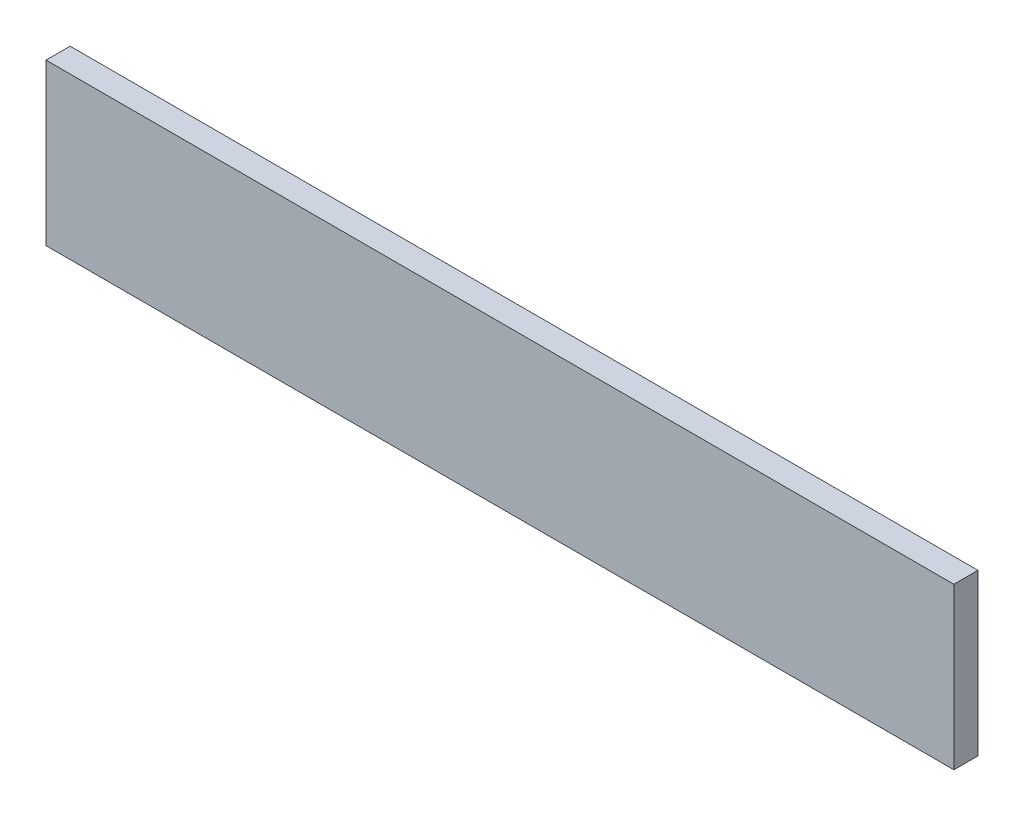
ISO-10303-21;
HEADER;
FILE_DESCRIPTION(('STEP AP214'),'2;1');
FILE_NAME('part.step','',(''),(''),'','','');
FILE_SCHEMA(('AUTOMOTIVE_DESIGN { 1 0 10303 214 1 1 1 1 }'));
ENDSEC;
DATA;
#1=APPLICATION_CONTEXT('core data for automotive mechanical design processes');
#2=APPLICATION_PROTOCOL_DEFINITION('international standard','automotive_design',2000,#1);
#3=PRODUCT_CONTEXT('',#1,'mechanical');
#4=PRODUCT('Part','Part','',(#3));
#5=PRODUCT_RELATED_PRODUCT_CATEGORY('part','',(#4));
#6=PRODUCT_DEFINITION_FORMATION('','',#4);
#7=PRODUCT_DEFINITION_CONTEXT('part definition',#1,'design');
#8=PRODUCT_DEFINITION('design','',#6,#7);
#9=PRODUCT_DEFINITION_SHAPE('','',#8);
#10=(LENGTH_UNIT() NAMED_UNIT(*) SI_UNIT(.MILLI.,.METRE.));
#11=(NAMED_UNIT(*) PLANE_ANGLE_UNIT() SI_UNIT($,.RADIAN.));
#12=(NAMED_UNIT(*) SI_UNIT($,.STERADIAN.) SOLID_ANGLE_UNIT());
#13=UNCERTAINTY_MEASURE_WITH_UNIT(LENGTH_MEASURE(1.E-05),#10,'distance_accuracy_value','');
#14=(GEOMETRIC_REPRESENTATION_CONTEXT(3) GLOBAL_UNCERTAINTY_ASSIGNED_CONTEXT((#13)) GLOBAL_UNIT_ASSIGNED_CONTEXT((#10,
#11,#12)) REPRESENTATION_CONTEXT('',''));
#15=CARTESIAN_POINT('',(0.,0.,0.));
#16=DIRECTION('',(0.,0.,1.));
#17=DIRECTION('',(1.,0.,0.));
#18=AXIS2_PLACEMENT_3D('',#15,#16,#17);
#19=CARTESIAN_POINT('',(0.,0.,19.05));
#20=DIRECTION('',(1.,0.,0.));
#21=DIRECTION('',(0.,0.,-1.));
#22=AXIS2_PLACEMENT_3D('',#19,#20,#21);
#23=PLANE('',#22);
#24=DIRECTION('',(0.,-1.,0.));
#25=VECTOR('',#24,1.);
#26=CARTESIAN_POINT('',(0.,0.,0.));
#27=LINE('',#26,#25);
#28=CARTESIAN_POINT('',(0.,127.,0.));
#29=VERTEX_POINT('',#28);
#30=CARTESIAN_POINT('',(0.,0.,0.));
#31=VERTEX_POINT('',#30);
#32=EDGE_CURVE('E107',#29,#31,#27,.T.);
#33=ORIENTED_EDGE('',*,*,#32,.T.);
#34=DIRECTION('',(0.,0.,-1.));
#35=VECTOR('',#34,1.);
#36=CARTESIAN_POINT('',(0.,0.,19.05));
#37=LINE('',#36,#35);
#38=CARTESIAN_POINT('',(0.,0.,19.05));
#39=VERTEX_POINT('',#38);
#40=EDGE_CURVE('E11',#39,#31,#37,.T.);
#41=ORIENTED_EDGE('',*,*,#40,.F.);
#42=DIRECTION('',(0.,-1.,0.));
#43=VECTOR('',#42,1.);
#44=CARTESIAN_POINT('',(0.,0.,19.05));
#45=LINE('',#44,#43);
#46=CARTESIAN_POINT('',(0.,127.,19.05));
#47=VERTEX_POINT('',#46);
#48=EDGE_CURVE('E91',#47,#39,#45,.T.);
#49=ORIENTED_EDGE('',*,*,#48,.F.);
#50=DIRECTION('',(0.,0.,-1.));
#51=VECTOR('',#50,1.);
#52=CARTESIAN_POINT('',(0.,127.,19.05));
#53=LINE('',#52,#51);
#54=EDGE_CURVE('E103',#47,#29,#53,.T.);
#55=ORIENTED_EDGE('',*,*,#54,.T.);
#56=EDGE_LOOP('',(#33,#41,#49,#55));
#57=FACE_BOUND('',#56,.T.);
#58=ADVANCED_FACE('F39',(#57),#23,.F.);
#59=CARTESIAN_POINT('',(0.,0.,19.05));
#60=DIRECTION('',(0.,1.,0.));
#61=DIRECTION('',(0.,0.,1.));
#62=AXIS2_PLACEMENT_3D('',#59,#60,#61);
#63=PLANE('',#62);
#64=DIRECTION('',(1.,0.,0.));
#65=VECTOR('',#64,1.);
#66=CARTESIAN_POINT('',(0.,0.,0.));
#67=LINE('',#66,#65);
#68=CARTESIAN_POINT('',(717.55,0.,0.));
#69=VERTEX_POINT('',#68);
#70=EDGE_CURVE('E96',#31,#69,#67,.T.);
#71=ORIENTED_EDGE('',*,*,#70,.T.);
#72=DIRECTION('',(0.,0.,-1.));
#73=VECTOR('',#72,1.);
#74=CARTESIAN_POINT('',(717.55,0.,19.05));
#75=LINE('',#74,#73);
#76=CARTESIAN_POINT('',(717.55,0.,19.05));
#77=VERTEX_POINT('',#76);
#78=EDGE_CURVE('E48',#77,#69,#75,.T.);
#79=ORIENTED_EDGE('',*,*,#78,.F.);
#80=DIRECTION('',(1.,0.,0.));
#81=VECTOR('',#80,1.);
#82=CARTESIAN_POINT('',(0.,0.,19.05));
#83=LINE('',#82,#81);
#84=EDGE_CURVE('E86',#39,#77,#83,.T.);
#85=ORIENTED_EDGE('',*,*,#84,.F.);
#86=ORIENTED_EDGE('',*,*,#40,.T.);
#87=EDGE_LOOP('',(#71,#79,#85,#86));
#88=FACE_BOUND('',#87,.T.);
#89=ADVANCED_FACE('F95',(#88),#63,.F.);
#90=CARTESIAN_POINT('',(717.55,0.,19.05));
#91=DIRECTION('',(-1.,0.,0.));
#92=DIRECTION('',(0.,0.,1.));
#93=AXIS2_PLACEMENT_3D('',#90,#91,#92);
#94=PLANE('',#93);
#95=DIRECTION('',(0.,1.,0.));
#96=VECTOR('',#95,1.);
#97=CARTESIAN_POINT('',(717.55,0.,0.));
#98=LINE('',#97,#96);
#99=CARTESIAN_POINT('',(717.55,127.,0.));
#100=VERTEX_POINT('',#99);
#101=EDGE_CURVE('E73',#69,#100,#98,.T.);
#102=ORIENTED_EDGE('',*,*,#101,.T.);
#103=DIRECTION('',(0.,0.,-1.));
#104=VECTOR('',#103,1.);
#105=CARTESIAN_POINT('',(717.55,127.,19.05));
#106=LINE('',#105,#104);
#107=CARTESIAN_POINT('',(717.55,127.,19.05));
#108=VERTEX_POINT('',#107);
#109=EDGE_CURVE('E98',#108,#100,#106,.T.);
#110=ORIENTED_EDGE('',*,*,#109,.F.);
#111=DIRECTION('',(0.,1.,0.));
#112=VECTOR('',#111,1.);
#113=CARTESIAN_POINT('',(717.55,0.,19.05));
#114=LINE('',#113,#112);
#115=EDGE_CURVE('E89',#77,#108,#114,.T.);
#116=ORIENTED_EDGE('',*,*,#115,.F.);
#117=ORIENTED_EDGE('',*,*,#78,.T.);
#118=EDGE_LOOP('',(#102,#110,#116,#117));
#119=FACE_BOUND('',#118,.T.);
#120=ADVANCED_FACE('F99',(#119),#94,.F.);
#121=CARTESIAN_POINT('',(0.,127.,19.05));
#122=DIRECTION('',(0.,-1.,0.));
#123=DIRECTION('',(0.,0.,-1.));
#124=AXIS2_PLACEMENT_3D('',#121,#122,#123);
#125=PLANE('',#124);
#126=DIRECTION('',(-1.,0.,0.));
#127=VECTOR('',#126,1.);
#128=CARTESIAN_POINT('',(0.,127.,0.));
#129=LINE('',#128,#127);
#130=EDGE_CURVE('E79',#100,#29,#129,.T.);
#131=ORIENTED_EDGE('',*,*,#130,.T.);
#132=ORIENTED_EDGE('',*,*,#54,.F.);
#133=DIRECTION('',(-1.,0.,0.));
#134=VECTOR('',#133,1.);
#135=CARTESIAN_POINT('',(0.,127.,19.05));
#136=LINE('',#135,#134);
#137=EDGE_CURVE('E56',#108,#47,#136,.T.);
#138=ORIENTED_EDGE('',*,*,#137,.F.);
#139=ORIENTED_EDGE('',*,*,#109,.T.);
#140=EDGE_LOOP('',(#131,#132,#138,#139));
#141=FACE_BOUND('',#140,.T.);
#142=ADVANCED_FACE('F120',(#141),#125,.F.);
#143=CARTESIAN_POINT('',(0.,0.,19.05));
#144=DIRECTION('',(0.,0.,-1.));
#145=DIRECTION('',(-1.,0.,0.));
#146=AXIS2_PLACEMENT_3D('',#143,#144,#145);
#147=PLANE('',#146);
#148=ORIENTED_EDGE('',*,*,#48,.T.);
#149=ORIENTED_EDGE('',*,*,#84,.T.);
#150=ORIENTED_EDGE('',*,*,#115,.T.);
#151=ORIENTED_EDGE('',*,*,#137,.T.);
#152=EDGE_LOOP('',(#148,#149,#150,#151));
#153=FACE_BOUND('',#152,.T.);
#154=ADVANCED_FACE('F87',(#153),#147,.F.);
#155=CARTESIAN_POINT('',(0.,0.,0.));
#156=DIRECTION('',(0.,0.,-1.));
#157=DIRECTION('',(-1.,0.,0.));
#158=AXIS2_PLACEMENT_3D('',#155,#156,#157);
#159=PLANE('',#158);
#160=ORIENTED_EDGE('',*,*,#32,.F.);
#161=ORIENTED_EDGE('',*,*,#130,.F.);
#162=ORIENTED_EDGE('',*,*,#101,.F.);
#163=ORIENTED_EDGE('',*,*,#70,.F.);
#164=EDGE_LOOP('',(#160,#161,#162,#163));
#165=FACE_BOUND('',#164,.T.);
#166=ADVANCED_FACE('F123',(#165),#159,.T.);
#167=CLOSED_SHELL('',(#58,#89,#120,#142,#154,#166));
#168=MANIFOLD_SOLID_BREP('B2',#167);
#169=ADVANCED_BREP_SHAPE_REPRESENTATION('',(#18,#168),#14);
#170=SHAPE_DEFINITION_REPRESENTATION(#9,#169);
ENDSEC;
END-ISO-10303-21;
